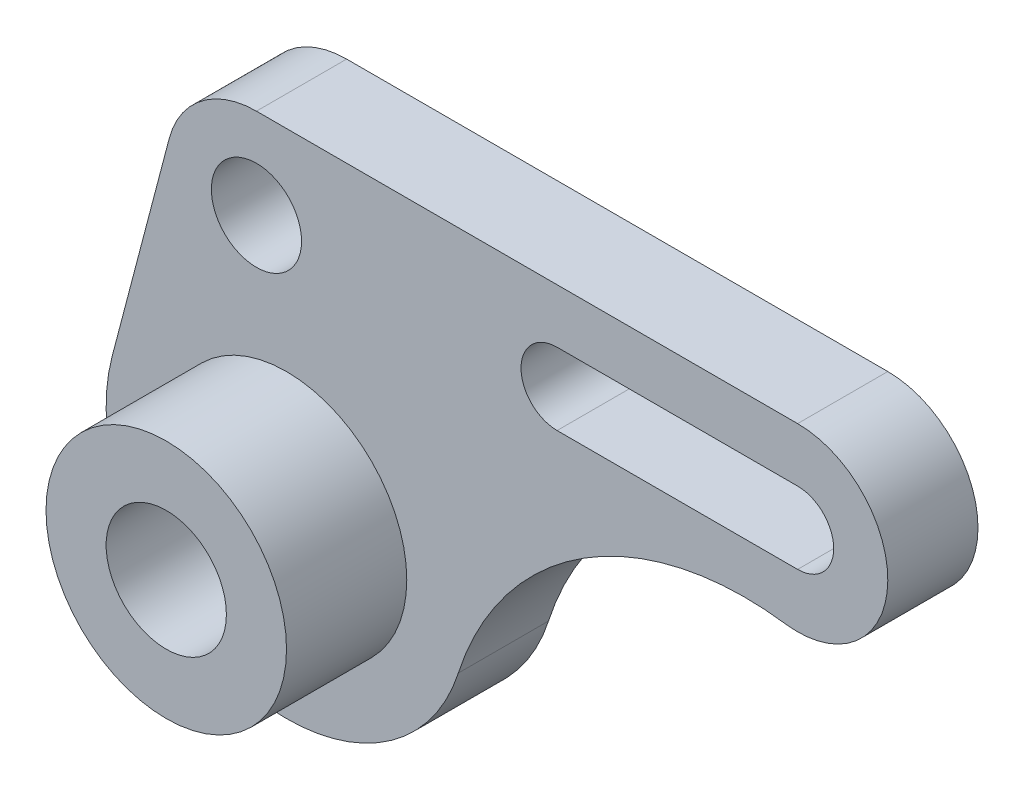
ISO-10303-21;
HEADER;
FILE_DESCRIPTION(('STEP AP214'),'2;1');
FILE_NAME('part.step','',(''),(''),'','','');
FILE_SCHEMA(('AUTOMOTIVE_DESIGN { 1 0 10303 214 1 1 1 1 }'));
ENDSEC;
DATA;
#1=APPLICATION_CONTEXT('core data for automotive mechanical design processes');
#2=APPLICATION_PROTOCOL_DEFINITION('international standard','automotive_design',2000,#1);
#3=PRODUCT_CONTEXT('',#1,'mechanical');
#4=PRODUCT('Part','Part','',(#3));
#5=PRODUCT_RELATED_PRODUCT_CATEGORY('part','',(#4));
#6=PRODUCT_DEFINITION_FORMATION('','',#4);
#7=PRODUCT_DEFINITION_CONTEXT('part definition',#1,'design');
#8=PRODUCT_DEFINITION('design','',#6,#7);
#9=PRODUCT_DEFINITION_SHAPE('','',#8);
#10=(LENGTH_UNIT() NAMED_UNIT(*) SI_UNIT(.MILLI.,.METRE.));
#11=(NAMED_UNIT(*) PLANE_ANGLE_UNIT() SI_UNIT($,.RADIAN.));
#12=(NAMED_UNIT(*) SI_UNIT($,.STERADIAN.) SOLID_ANGLE_UNIT());
#13=UNCERTAINTY_MEASURE_WITH_UNIT(LENGTH_MEASURE(1.E-05),#10,'distance_accuracy_value','');
#14=(GEOMETRIC_REPRESENTATION_CONTEXT(3) GLOBAL_UNCERTAINTY_ASSIGNED_CONTEXT((#13)) GLOBAL_UNIT_ASSIGNED_CONTEXT((#10,
#11,#12)) REPRESENTATION_CONTEXT('',''));
#15=CARTESIAN_POINT('',(0.,0.,0.));
#16=DIRECTION('',(0.,0.,1.));
#17=DIRECTION('',(1.,0.,0.));
#18=AXIS2_PLACEMENT_3D('',#15,#16,#17);
#19=CARTESIAN_POINT('',(93.8424440110008,-35.6908090434669,15.));
#20=DIRECTION('',(0.,0.,-1.));
#21=DIRECTION('',(-1.,0.,0.));
#22=AXIS2_PLACEMENT_3D('',#19,#20,#21);
#23=PLANE('',#22);
#24=CARTESIAN_POINT('',(12.6542368226914,28.7091312316904,15.));
#25=DIRECTION('',(0.,0.,1.));
#26=DIRECTION('',(1.,0.,0.));
#27=AXIS2_PLACEMENT_3D('',#24,#25,#26);
#28=CIRCLE('',#27,7.5);
#29=CARTESIAN_POINT('',(20.1542368226914,28.7091312316904,15.));
#30=VERTEX_POINT('',#29);
#31=EDGE_CURVE('E231',#30,#30,#28,.T.);
#32=ORIENTED_EDGE('',*,*,#31,.F.);
#33=EDGE_LOOP('',(#32));
#34=FACE_BOUND('',#33,.T.);
#35=CARTESIAN_POINT('',(17.6542368226914,-11.2908687683096,15.));
#36=DIRECTION('',(0.,0.,1.));
#37=DIRECTION('',(1.,0.,0.));
#38=AXIS2_PLACEMENT_3D('',#35,#36,#37);
#39=CIRCLE('',#38,20.);
#40=CARTESIAN_POINT('',(37.6542368226914,-11.2908687683096,15.));
#41=VERTEX_POINT('',#40);
#42=EDGE_CURVE('E234',#41,#41,#39,.T.);
#43=ORIENTED_EDGE('',*,*,#42,.F.);
#44=EDGE_LOOP('',(#43));
#45=FACE_BOUND('',#44,.T.);
#46=CARTESIAN_POINT('',(93.8424440110008,-35.6908090434669,15.));
#47=DIRECTION('',(0.,0.,-1.));
#48=DIRECTION('',(-1.,0.,0.));
#49=AXIS2_PLACEMENT_3D('',#46,#47,#48);
#50=CIRCLE('',#49,50.);
#51=CARTESIAN_POINT('',(46.2248145183074,-20.4408463714936,15.));
#52=VERTEX_POINT('',#51);
#53=CARTESIAN_POINT('',(100.62074617384,13.847606552808,15.));
#54=VERTEX_POINT('',#53);
#55=EDGE_CURVE('E240',#52,#54,#50,.T.);
#56=ORIENTED_EDGE('',*,*,#55,.T.);
#57=CARTESIAN_POINT('',(102.654236822691,28.7091312316904,15.));
#58=DIRECTION('',(0.,0.,1.));
#59=DIRECTION('',(1.,0.,0.));
#60=AXIS2_PLACEMENT_3D('',#57,#58,#59);
#61=CIRCLE('',#60,15.);
#62=CARTESIAN_POINT('',(102.654236822691,43.7091312316904,15.));
#63=VERTEX_POINT('',#62);
#64=EDGE_CURVE('E243',#54,#63,#61,.T.);
#65=ORIENTED_EDGE('',*,*,#64,.T.);
#66=DIRECTION('',(1.,0.,0.));
#67=VECTOR('',#66,1.);
#68=CARTESIAN_POINT('',(12.6542368226914,43.7091312316904,15.));
#69=LINE('',#68,#67);
#70=CARTESIAN_POINT('',(12.6542368226914,43.7091312316904,15.));
#71=VERTEX_POINT('',#70);
#72=EDGE_CURVE('E246',#71,#63,#69,.T.);
#73=ORIENTED_EDGE('',*,*,#72,.F.);
#74=CARTESIAN_POINT('',(12.6542368226914,28.7091312316904,15.));
#75=DIRECTION('',(0.,0.,1.));
#76=DIRECTION('',(1.,0.,0.));
#77=AXIS2_PLACEMENT_3D('',#74,#75,#76);
#78=CIRCLE('',#77,15.);
#79=CARTESIAN_POINT('',(-1.85342122078162,32.5206739762563,15.));
#80=VERTEX_POINT('',#79);
#81=EDGE_CURVE('E249',#71,#80,#78,.T.);
#82=ORIENTED_EDGE('',*,*,#81,.T.);
#83=DIRECTION('',(0.254102849637725,0.967177202898201,0.));
#84=VECTOR('',#83,1.);
#85=CARTESIAN_POINT('',(-11.3610792642546,-3.66778327917782,15.));
#86=LINE('',#85,#84);
#87=CARTESIAN_POINT('',(-11.3610792642546,-3.66778327917782,15.));
#88=VERTEX_POINT('',#87);
#89=EDGE_CURVE('E251',#88,#80,#86,.T.);
#90=ORIENTED_EDGE('',*,*,#89,.F.);
#91=CARTESIAN_POINT('',(17.6542368226914,-11.2908687683096,15.));
#92=DIRECTION('',(0.,0.,1.));
#93=DIRECTION('',(1.,0.,0.));
#94=AXIS2_PLACEMENT_3D('',#91,#92,#93);
#95=CIRCLE('',#94,30.);
#96=EDGE_CURVE('E254',#88,#52,#95,.T.);
#97=ORIENTED_EDGE('',*,*,#96,.T.);
#98=EDGE_LOOP('',(#56,#65,#73,#82,#90,#97));
#99=FACE_BOUND('',#98,.T.);
#100=CARTESIAN_POINT('',(62.6542368226914,28.7091312316904,15.));
#101=DIRECTION('',(0.,0.,1.));
#102=DIRECTION('',(1.,0.,0.));
#103=AXIS2_PLACEMENT_3D('',#100,#101,#102);
#104=CIRCLE('',#103,6.);
#105=CARTESIAN_POINT('',(62.6542368226914,34.7091312316904,15.));
#106=VERTEX_POINT('',#105);
#107=CARTESIAN_POINT('',(62.6542368226914,22.7091312316904,15.));
#108=VERTEX_POINT('',#107);
#109=EDGE_CURVE('E194',#106,#108,#104,.T.);
#110=ORIENTED_EDGE('',*,*,#109,.F.);
#111=DIRECTION('',(1.,0.,0.));
#112=VECTOR('',#111,1.);
#113=CARTESIAN_POINT('',(62.6542368226914,34.7091312316904,15.));
#114=LINE('',#113,#112);
#115=CARTESIAN_POINT('',(102.654236822691,34.7091312316904,15.));
#116=VERTEX_POINT('',#115);
#117=EDGE_CURVE('E216',#106,#116,#114,.T.);
#118=ORIENTED_EDGE('',*,*,#117,.T.);
#119=CARTESIAN_POINT('',(102.654236822691,28.7091312316904,15.));
#120=DIRECTION('',(0.,0.,1.));
#121=DIRECTION('',(1.,0.,0.));
#122=AXIS2_PLACEMENT_3D('',#119,#120,#121);
#123=CIRCLE('',#122,5.99999999999999);
#124=CARTESIAN_POINT('',(102.654236822691,22.7091312316905,15.));
#125=VERTEX_POINT('',#124);
#126=EDGE_CURVE('E214',#125,#116,#123,.T.);
#127=ORIENTED_EDGE('',*,*,#126,.F.);
#128=DIRECTION('',(1.,0.,0.));
#129=VECTOR('',#128,1.);
#130=CARTESIAN_POINT('',(62.6542368226914,22.7091312316904,15.));
#131=LINE('',#130,#129);
#132=EDGE_CURVE('E202',#108,#125,#131,.T.);
#133=ORIENTED_EDGE('',*,*,#132,.F.);
#134=EDGE_LOOP('',(#110,#118,#127,#133));
#135=FACE_BOUND('',#134,.T.);
#136=ADVANCED_FACE('F117',(#34,#45,#99,#135),#23,.F.);
#137=CARTESIAN_POINT('',(93.8424440110008,-35.6908090434669,0.));
#138=DIRECTION('',(0.,0.,-1.));
#139=DIRECTION('',(-1.,0.,0.));
#140=AXIS2_PLACEMENT_3D('',#137,#138,#139);
#141=PLANE('',#140);
#142=CARTESIAN_POINT('',(93.8424440110008,-35.6908090434669,0.));
#143=DIRECTION('',(0.,0.,-1.));
#144=DIRECTION('',(-1.,0.,0.));
#145=AXIS2_PLACEMENT_3D('',#142,#143,#144);
#146=CIRCLE('',#145,50.);
#147=CARTESIAN_POINT('',(46.2248145183074,-20.4408463714936,0.));
#148=VERTEX_POINT('',#147);
#149=CARTESIAN_POINT('',(100.62074617384,13.847606552808,0.));
#150=VERTEX_POINT('',#149);
#151=EDGE_CURVE('E239',#148,#150,#146,.T.);
#152=ORIENTED_EDGE('',*,*,#151,.F.);
#153=CARTESIAN_POINT('',(17.6542368226914,-11.2908687683096,0.));
#154=DIRECTION('',(0.,0.,1.));
#155=DIRECTION('',(1.,0.,0.));
#156=AXIS2_PLACEMENT_3D('',#153,#154,#155);
#157=CIRCLE('',#156,30.);
#158=CARTESIAN_POINT('',(-11.3610792642546,-3.66778327917782,0.));
#159=VERTEX_POINT('',#158);
#160=EDGE_CURVE('E244',#159,#148,#157,.T.);
#161=ORIENTED_EDGE('',*,*,#160,.F.);
#162=DIRECTION('',(0.254102849637725,0.967177202898201,0.));
#163=VECTOR('',#162,1.);
#164=CARTESIAN_POINT('',(-11.3610792642546,-3.66778327917782,0.));
#165=LINE('',#164,#163);
#166=CARTESIAN_POINT('',(-1.85342122078162,32.5206739762563,0.));
#167=VERTEX_POINT('',#166);
#168=EDGE_CURVE('E268',#159,#167,#165,.T.);
#169=ORIENTED_EDGE('',*,*,#168,.T.);
#170=CARTESIAN_POINT('',(12.6542368226914,28.7091312316904,0.));
#171=DIRECTION('',(0.,0.,1.));
#172=DIRECTION('',(1.,0.,0.));
#173=AXIS2_PLACEMENT_3D('',#170,#171,#172);
#174=CIRCLE('',#173,15.);
#175=CARTESIAN_POINT('',(12.6542368226914,43.7091312316904,0.));
#176=VERTEX_POINT('',#175);
#177=EDGE_CURVE('E265',#176,#167,#174,.T.);
#178=ORIENTED_EDGE('',*,*,#177,.F.);
#179=DIRECTION('',(1.,0.,0.));
#180=VECTOR('',#179,1.);
#181=CARTESIAN_POINT('',(12.6542368226914,43.7091312316904,0.));
#182=LINE('',#181,#180);
#183=CARTESIAN_POINT('',(102.654236822691,43.7091312316904,0.));
#184=VERTEX_POINT('',#183);
#185=EDGE_CURVE('E262',#176,#184,#182,.T.);
#186=ORIENTED_EDGE('',*,*,#185,.T.);
#187=CARTESIAN_POINT('',(102.654236822691,28.7091312316904,0.));
#188=DIRECTION('',(0.,0.,1.));
#189=DIRECTION('',(1.,0.,0.));
#190=AXIS2_PLACEMENT_3D('',#187,#188,#189);
#191=CIRCLE('',#190,15.);
#192=EDGE_CURVE('E259',#150,#184,#191,.T.);
#193=ORIENTED_EDGE('',*,*,#192,.F.);
#194=EDGE_LOOP('',(#152,#161,#169,#178,#186,#193));
#195=FACE_BOUND('',#194,.T.);
#196=CARTESIAN_POINT('',(12.6542368226914,28.7091312316904,0.));
#197=DIRECTION('',(0.,0.,1.));
#198=DIRECTION('',(1.,0.,0.));
#199=AXIS2_PLACEMENT_3D('',#196,#197,#198);
#200=CIRCLE('',#199,7.5);
#201=CARTESIAN_POINT('',(20.1542368226914,28.7091312316904,0.));
#202=VERTEX_POINT('',#201);
#203=EDGE_CURVE('E210',#202,#202,#200,.T.);
#204=ORIENTED_EDGE('',*,*,#203,.T.);
#205=EDGE_LOOP('',(#204));
#206=FACE_BOUND('',#205,.T.);
#207=DIRECTION('',(1.,0.,0.));
#208=VECTOR('',#207,1.);
#209=CARTESIAN_POINT('',(62.6542368226914,34.7091312316904,0.));
#210=LINE('',#209,#208);
#211=CARTESIAN_POINT('',(62.6542368226914,34.7091312316904,0.));
#212=VERTEX_POINT('',#211);
#213=CARTESIAN_POINT('',(102.654236822691,34.7091312316904,0.));
#214=VERTEX_POINT('',#213);
#215=EDGE_CURVE('E203',#212,#214,#210,.T.);
#216=ORIENTED_EDGE('',*,*,#215,.F.);
#217=CARTESIAN_POINT('',(62.6542368226914,28.7091312316904,0.));
#218=DIRECTION('',(0.,0.,1.));
#219=DIRECTION('',(1.,0.,0.));
#220=AXIS2_PLACEMENT_3D('',#217,#218,#219);
#221=CIRCLE('',#220,6.);
#222=CARTESIAN_POINT('',(62.6542368226914,22.7091312316904,0.));
#223=VERTEX_POINT('',#222);
#224=EDGE_CURVE('E140',#212,#223,#221,.T.);
#225=ORIENTED_EDGE('',*,*,#224,.T.);
#226=DIRECTION('',(1.,0.,0.));
#227=VECTOR('',#226,1.);
#228=CARTESIAN_POINT('',(62.6542368226914,22.7091312316904,0.));
#229=LINE('',#228,#227);
#230=CARTESIAN_POINT('',(102.654236822691,22.7091312316905,0.));
#231=VERTEX_POINT('',#230);
#232=EDGE_CURVE('E209',#223,#231,#229,.T.);
#233=ORIENTED_EDGE('',*,*,#232,.T.);
#234=CARTESIAN_POINT('',(102.654236822691,28.7091312316904,0.));
#235=DIRECTION('',(0.,0.,1.));
#236=DIRECTION('',(1.,0.,0.));
#237=AXIS2_PLACEMENT_3D('',#234,#235,#236);
#238=CIRCLE('',#237,5.99999999999999);
#239=EDGE_CURVE('E224',#231,#214,#238,.T.);
#240=ORIENTED_EDGE('',*,*,#239,.T.);
#241=EDGE_LOOP('',(#216,#225,#233,#240));
#242=FACE_BOUND('',#241,.T.);
#243=CARTESIAN_POINT('',(17.6542368226914,-11.2908687683096,0.));
#244=DIRECTION('',(0.,0.,1.));
#245=DIRECTION('',(1.,0.,0.));
#246=AXIS2_PLACEMENT_3D('',#243,#244,#245);
#247=CIRCLE('',#246,10.);
#248=CARTESIAN_POINT('',(27.6542368226914,-11.2908687683096,0.));
#249=VERTEX_POINT('',#248);
#250=EDGE_CURVE('E359',#249,#249,#247,.T.);
#251=ORIENTED_EDGE('',*,*,#250,.T.);
#252=EDGE_LOOP('',(#251));
#253=FACE_BOUND('',#252,.T.);
#254=ADVANCED_FACE('F290',(#195,#206,#242,#253),#141,.T.);
#255=CARTESIAN_POINT('',(93.8424440110008,-35.6908090434669,15.));
#256=DIRECTION('',(0.,0.,-1.));
#257=DIRECTION('',(-1.,0.,0.));
#258=AXIS2_PLACEMENT_3D('',#255,#256,#257);
#259=CYLINDRICAL_SURFACE('',#258,50.);
#260=ORIENTED_EDGE('',*,*,#151,.T.);
#261=DIRECTION('',(0.,0.,-1.));
#262=VECTOR('',#261,1.);
#263=CARTESIAN_POINT('',(100.62074617384,13.847606552808,15.));
#264=LINE('',#263,#262);
#265=EDGE_CURVE('E12',#54,#150,#264,.T.);
#266=ORIENTED_EDGE('',*,*,#265,.F.);
#267=ORIENTED_EDGE('',*,*,#55,.F.);
#268=DIRECTION('',(0.,0.,-1.));
#269=VECTOR('',#268,1.);
#270=CARTESIAN_POINT('',(46.2248145183074,-20.4408463714936,15.));
#271=LINE('',#270,#269);
#272=EDGE_CURVE('E256',#52,#148,#271,.T.);
#273=ORIENTED_EDGE('',*,*,#272,.T.);
#274=EDGE_LOOP('',(#260,#266,#267,#273));
#275=FACE_BOUND('',#274,.T.);
#276=ADVANCED_FACE('F119',(#275),#259,.F.);
#277=CARTESIAN_POINT('',(102.654236822691,28.7091312316904,15.));
#278=DIRECTION('',(0.,0.,-1.));
#279=DIRECTION('',(-1.,0.,0.));
#280=AXIS2_PLACEMENT_3D('',#277,#278,#279);
#281=CYLINDRICAL_SURFACE('',#280,15.);
#282=ORIENTED_EDGE('',*,*,#192,.T.);
#283=DIRECTION('',(0.,0.,-1.));
#284=VECTOR('',#283,1.);
#285=CARTESIAN_POINT('',(102.654236822691,43.7091312316904,15.));
#286=LINE('',#285,#284);
#287=EDGE_CURVE('E125',#63,#184,#286,.T.);
#288=ORIENTED_EDGE('',*,*,#287,.F.);
#289=ORIENTED_EDGE('',*,*,#64,.F.);
#290=ORIENTED_EDGE('',*,*,#265,.T.);
#291=EDGE_LOOP('',(#282,#288,#289,#290));
#292=FACE_BOUND('',#291,.T.);
#293=ADVANCED_FACE('F285',(#292),#281,.T.);
#294=CARTESIAN_POINT('',(12.6542368226914,43.7091312316904,15.));
#295=DIRECTION('',(0.,1.,0.));
#296=DIRECTION('',(-1.,0.,0.));
#297=AXIS2_PLACEMENT_3D('',#294,#295,#296);
#298=PLANE('',#297);
#299=ORIENTED_EDGE('',*,*,#185,.F.);
#300=DIRECTION('',(0.,0.,-1.));
#301=VECTOR('',#300,1.);
#302=CARTESIAN_POINT('',(12.6542368226914,43.7091312316904,15.));
#303=LINE('',#302,#301);
#304=EDGE_CURVE('E278',#71,#176,#303,.T.);
#305=ORIENTED_EDGE('',*,*,#304,.F.);
#306=ORIENTED_EDGE('',*,*,#72,.T.);
#307=ORIENTED_EDGE('',*,*,#287,.T.);
#308=EDGE_LOOP('',(#299,#305,#306,#307));
#309=FACE_BOUND('',#308,.T.);
#310=ADVANCED_FACE('F282',(#309),#298,.T.);
#311=CARTESIAN_POINT('',(12.6542368226914,28.7091312316904,15.));
#312=DIRECTION('',(0.,0.,-1.));
#313=DIRECTION('',(-1.,0.,0.));
#314=AXIS2_PLACEMENT_3D('',#311,#312,#313);
#315=CYLINDRICAL_SURFACE('',#314,15.);
#316=ORIENTED_EDGE('',*,*,#177,.T.);
#317=DIRECTION('',(0.,0.,-1.));
#318=VECTOR('',#317,1.);
#319=CARTESIAN_POINT('',(-1.85342122078162,32.5206739762563,15.));
#320=LINE('',#319,#318);
#321=EDGE_CURVE('E276',#80,#167,#320,.T.);
#322=ORIENTED_EDGE('',*,*,#321,.F.);
#323=ORIENTED_EDGE('',*,*,#81,.F.);
#324=ORIENTED_EDGE('',*,*,#304,.T.);
#325=EDGE_LOOP('',(#316,#322,#323,#324));
#326=FACE_BOUND('',#325,.T.);
#327=ADVANCED_FACE('F296',(#326),#315,.T.);
#328=CARTESIAN_POINT('',(-11.3610792642546,-3.66778327917782,15.));
#329=DIRECTION('',(-0.967177202898201,0.254102849637725,0.));
#330=DIRECTION('',(-0.254102849637725,-0.967177202898201,0.));
#331=AXIS2_PLACEMENT_3D('',#328,#329,#330);
#332=PLANE('',#331);
#333=ORIENTED_EDGE('',*,*,#168,.F.);
#334=DIRECTION('',(0.,0.,-1.));
#335=VECTOR('',#334,1.);
#336=CARTESIAN_POINT('',(-11.3610792642546,-3.66778327917782,15.));
#337=LINE('',#336,#335);
#338=EDGE_CURVE('E274',#88,#159,#337,.T.);
#339=ORIENTED_EDGE('',*,*,#338,.F.);
#340=ORIENTED_EDGE('',*,*,#89,.T.);
#341=ORIENTED_EDGE('',*,*,#321,.T.);
#342=EDGE_LOOP('',(#333,#339,#340,#341));
#343=FACE_BOUND('',#342,.T.);
#344=ADVANCED_FACE('F306',(#343),#332,.T.);
#345=CARTESIAN_POINT('',(17.6542368226914,-11.2908687683096,15.));
#346=DIRECTION('',(0.,0.,-1.));
#347=DIRECTION('',(-1.,0.,0.));
#348=AXIS2_PLACEMENT_3D('',#345,#346,#347);
#349=CYLINDRICAL_SURFACE('',#348,30.);
#350=ORIENTED_EDGE('',*,*,#160,.T.);
#351=ORIENTED_EDGE('',*,*,#272,.F.);
#352=ORIENTED_EDGE('',*,*,#96,.F.);
#353=ORIENTED_EDGE('',*,*,#338,.T.);
#354=EDGE_LOOP('',(#350,#351,#352,#353));
#355=FACE_BOUND('',#354,.T.);
#356=ADVANCED_FACE('F307',(#355),#349,.T.);
#357=CARTESIAN_POINT('',(12.6542368226914,28.7091312316904,15.));
#358=DIRECTION('',(0.,0.,-1.));
#359=DIRECTION('',(-1.,0.,0.));
#360=AXIS2_PLACEMENT_3D('',#357,#358,#359);
#361=CYLINDRICAL_SURFACE('',#360,7.5);
#362=ORIENTED_EDGE('',*,*,#31,.T.);
#363=EDGE_LOOP('',(#362));
#364=FACE_BOUND('',#363,.T.);
#365=ORIENTED_EDGE('',*,*,#203,.F.);
#366=EDGE_LOOP('',(#365));
#367=FACE_BOUND('',#366,.T.);
#368=ADVANCED_FACE('F309',(#364,#367),#361,.F.);
#369=CARTESIAN_POINT('',(62.6542368226914,28.7091312316904,15.));
#370=DIRECTION('',(0.,0.,-1.));
#371=DIRECTION('',(-1.,0.,0.));
#372=AXIS2_PLACEMENT_3D('',#369,#370,#371);
#373=CYLINDRICAL_SURFACE('',#372,6.);
#374=ORIENTED_EDGE('',*,*,#224,.F.);
#375=DIRECTION('',(0.,0.,-1.));
#376=VECTOR('',#375,1.);
#377=CARTESIAN_POINT('',(62.6542368226914,34.7091312316904,15.));
#378=LINE('',#377,#376);
#379=EDGE_CURVE('E198',#106,#212,#378,.T.);
#380=ORIENTED_EDGE('',*,*,#379,.F.);
#381=ORIENTED_EDGE('',*,*,#109,.T.);
#382=DIRECTION('',(0.,0.,-1.));
#383=VECTOR('',#382,1.);
#384=CARTESIAN_POINT('',(62.6542368226914,22.7091312316904,15.));
#385=LINE('',#384,#383);
#386=EDGE_CURVE('E197',#108,#223,#385,.T.);
#387=ORIENTED_EDGE('',*,*,#386,.T.);
#388=EDGE_LOOP('',(#374,#380,#381,#387));
#389=FACE_BOUND('',#388,.T.);
#390=ADVANCED_FACE('F196',(#389),#373,.F.);
#391=CARTESIAN_POINT('',(62.6542368226914,22.7091312316904,15.));
#392=DIRECTION('',(0.,1.,0.));
#393=DIRECTION('',(-1.,0.,0.));
#394=AXIS2_PLACEMENT_3D('',#391,#392,#393);
#395=PLANE('',#394);
#396=ORIENTED_EDGE('',*,*,#232,.F.);
#397=ORIENTED_EDGE('',*,*,#386,.F.);
#398=ORIENTED_EDGE('',*,*,#132,.T.);
#399=DIRECTION('',(0.,0.,-1.));
#400=VECTOR('',#399,1.);
#401=CARTESIAN_POINT('',(102.654236822691,22.7091312316905,15.));
#402=LINE('',#401,#400);
#403=EDGE_CURVE('E211',#125,#231,#402,.T.);
#404=ORIENTED_EDGE('',*,*,#403,.T.);
#405=EDGE_LOOP('',(#396,#397,#398,#404));
#406=FACE_BOUND('',#405,.T.);
#407=ADVANCED_FACE('F206',(#406),#395,.T.);
#408=CARTESIAN_POINT('',(102.654236822691,28.7091312316904,15.));
#409=DIRECTION('',(0.,0.,-1.));
#410=DIRECTION('',(-1.,0.,0.));
#411=AXIS2_PLACEMENT_3D('',#408,#409,#410);
#412=CYLINDRICAL_SURFACE('',#411,5.99999999999999);
#413=ORIENTED_EDGE('',*,*,#239,.F.);
#414=ORIENTED_EDGE('',*,*,#403,.F.);
#415=ORIENTED_EDGE('',*,*,#126,.T.);
#416=DIRECTION('',(0.,0.,-1.));
#417=VECTOR('',#416,1.);
#418=CARTESIAN_POINT('',(102.654236822691,34.7091312316904,15.));
#419=LINE('',#418,#417);
#420=EDGE_CURVE('E132',#116,#214,#419,.T.);
#421=ORIENTED_EDGE('',*,*,#420,.T.);
#422=EDGE_LOOP('',(#413,#414,#415,#421));
#423=FACE_BOUND('',#422,.T.);
#424=ADVANCED_FACE('F333',(#423),#412,.F.);
#425=CARTESIAN_POINT('',(62.6542368226914,34.7091312316904,15.));
#426=DIRECTION('',(0.,1.,0.));
#427=DIRECTION('',(0.,0.,1.));
#428=AXIS2_PLACEMENT_3D('',#425,#426,#427);
#429=PLANE('',#428);
#430=ORIENTED_EDGE('',*,*,#215,.T.);
#431=ORIENTED_EDGE('',*,*,#420,.F.);
#432=ORIENTED_EDGE('',*,*,#117,.F.);
#433=ORIENTED_EDGE('',*,*,#379,.T.);
#434=EDGE_LOOP('',(#430,#431,#432,#433));
#435=FACE_BOUND('',#434,.T.);
#436=ADVANCED_FACE('F336',(#435),#429,.F.);
#437=CARTESIAN_POINT('',(17.6542368226914,-11.2908687683096,35.));
#438=DIRECTION('',(0.,0.,-1.));
#439=DIRECTION('',(-1.,0.,0.));
#440=AXIS2_PLACEMENT_3D('',#437,#438,#439);
#441=CYLINDRICAL_SURFACE('',#440,20.);
#442=CARTESIAN_POINT('',(17.6542368226914,-11.2908687683096,35.));
#443=DIRECTION('',(0.,0.,1.));
#444=DIRECTION('',(1.,0.,0.));
#445=AXIS2_PLACEMENT_3D('',#442,#443,#444);
#446=CIRCLE('',#445,20.);
#447=CARTESIAN_POINT('',(37.6542368226914,-11.2908687683096,35.));
#448=VERTEX_POINT('',#447);
#449=EDGE_CURVE('E222',#448,#448,#446,.T.);
#450=ORIENTED_EDGE('',*,*,#449,.F.);
#451=EDGE_LOOP('',(#450));
#452=FACE_BOUND('',#451,.T.);
#453=ORIENTED_EDGE('',*,*,#42,.T.);
#454=EDGE_LOOP('',(#453));
#455=FACE_BOUND('',#454,.T.);
#456=ADVANCED_FACE('F340',(#452,#455),#441,.T.);
#457=CARTESIAN_POINT('',(17.6542368226914,-11.2908687683096,35.));
#458=DIRECTION('',(0.,0.,1.));
#459=DIRECTION('',(1.,0.,0.));
#460=AXIS2_PLACEMENT_3D('',#457,#458,#459);
#461=PLANE('',#460);
#462=ORIENTED_EDGE('',*,*,#449,.T.);
#463=EDGE_LOOP('',(#462));
#464=FACE_BOUND('',#463,.T.);
#465=CARTESIAN_POINT('',(17.6542368226914,-11.2908687683096,35.));
#466=DIRECTION('',(0.,0.,1.));
#467=DIRECTION('',(1.,0.,0.));
#468=AXIS2_PLACEMENT_3D('',#465,#466,#467);
#469=CIRCLE('',#468,10.);
#470=CARTESIAN_POINT('',(27.6542368226914,-11.2908687683096,35.));
#471=VERTEX_POINT('',#470);
#472=EDGE_CURVE('E356',#471,#471,#469,.T.);
#473=ORIENTED_EDGE('',*,*,#472,.F.);
#474=EDGE_LOOP('',(#473));
#475=FACE_BOUND('',#474,.T.);
#476=ADVANCED_FACE('F343',(#464,#475),#461,.T.);
#477=CARTESIAN_POINT('',(17.6542368226914,-11.2908687683096,35.));
#478=DIRECTION('',(0.,0.,-1.));
#479=DIRECTION('',(-1.,0.,0.));
#480=AXIS2_PLACEMENT_3D('',#477,#478,#479);
#481=CYLINDRICAL_SURFACE('',#480,10.);
#482=ORIENTED_EDGE('',*,*,#472,.T.);
#483=EDGE_LOOP('',(#482));
#484=FACE_BOUND('',#483,.T.);
#485=ORIENTED_EDGE('',*,*,#250,.F.);
#486=EDGE_LOOP('',(#485));
#487=FACE_BOUND('',#486,.T.);
#488=ADVANCED_FACE('F347',(#484,#487),#481,.F.);
#489=CLOSED_SHELL('',(#136,#254,#276,#293,#310,#327,#344,#356,#368,#390,#407,#424,#436,#456,
#476,#488));
#490=MANIFOLD_SOLID_BREP('B2',#489);
#491=ADVANCED_BREP_SHAPE_REPRESENTATION('',(#18,#490),#14);
#492=SHAPE_DEFINITION_REPRESENTATION(#9,#491);
ENDSEC;
END-ISO-10303-21;
